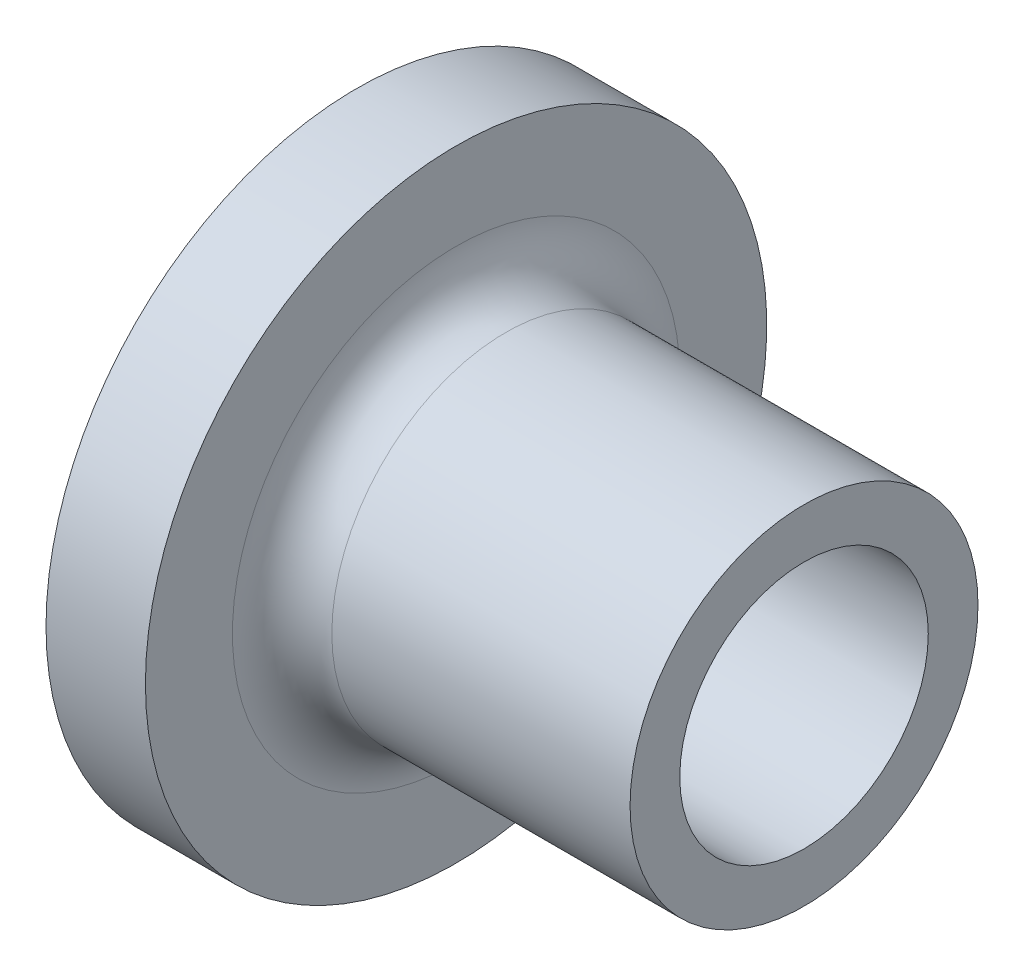
ISO-10303-21;
HEADER;
FILE_DESCRIPTION(('STEP AP214'),'2;1');
FILE_NAME('part.step','',(''),(''),'','','');
FILE_SCHEMA(('AUTOMOTIVE_DESIGN { 1 0 10303 214 1 1 1 1 }'));
ENDSEC;
DATA;
#1=APPLICATION_CONTEXT('core data for automotive mechanical design processes');
#2=APPLICATION_PROTOCOL_DEFINITION('international standard','automotive_design',2000,#1);
#3=PRODUCT_CONTEXT('',#1,'mechanical');
#4=PRODUCT('Part','Part','',(#3));
#5=PRODUCT_RELATED_PRODUCT_CATEGORY('part','',(#4));
#6=PRODUCT_DEFINITION_FORMATION('','',#4);
#7=PRODUCT_DEFINITION_CONTEXT('part definition',#1,'design');
#8=PRODUCT_DEFINITION('design','',#6,#7);
#9=PRODUCT_DEFINITION_SHAPE('','',#8);
#10=(LENGTH_UNIT() NAMED_UNIT(*) SI_UNIT(.MILLI.,.METRE.));
#11=(NAMED_UNIT(*) PLANE_ANGLE_UNIT() SI_UNIT($,.RADIAN.));
#12=(NAMED_UNIT(*) SI_UNIT($,.STERADIAN.) SOLID_ANGLE_UNIT());
#13=UNCERTAINTY_MEASURE_WITH_UNIT(LENGTH_MEASURE(1.E-05),#10,'distance_accuracy_value','');
#14=(GEOMETRIC_REPRESENTATION_CONTEXT(3) GLOBAL_UNCERTAINTY_ASSIGNED_CONTEXT((#13)) GLOBAL_UNIT_ASSIGNED_CONTEXT((#10,
#11,#12)) REPRESENTATION_CONTEXT('',''));
#15=CARTESIAN_POINT('',(0.,0.,0.));
#16=DIRECTION('',(0.,0.,1.));
#17=DIRECTION('',(1.,0.,0.));
#18=AXIS2_PLACEMENT_3D('',#15,#16,#17);
#19=CARTESIAN_POINT('',(-5.5,0.,0.));
#20=DIRECTION('',(-1.,0.,0.));
#21=DIRECTION('',(0.,0.,1.));
#22=AXIS2_PLACEMENT_3D('',#19,#20,#21);
#23=PLANE('',#22);
#24=CARTESIAN_POINT('',(-5.5,0.,0.));
#25=DIRECTION('',(-1.,0.,0.));
#26=DIRECTION('',(0.,0.,1.));
#27=AXIS2_PLACEMENT_3D('',#24,#25,#26);
#28=CIRCLE('',#27,6.25);
#29=CARTESIAN_POINT('',(-5.5,0.,6.25));
#30=VERTEX_POINT('',#29);
#31=EDGE_CURVE('E69',#30,#30,#28,.T.);
#32=ORIENTED_EDGE('',*,*,#31,.T.);
#33=EDGE_LOOP('',(#32));
#34=FACE_BOUND('',#33,.T.);
#35=CARTESIAN_POINT('',(-5.5,0.,0.));
#36=DIRECTION('',(-1.,0.,0.));
#37=DIRECTION('',(0.,0.,1.));
#38=AXIS2_PLACEMENT_3D('',#35,#36,#37);
#39=CIRCLE('',#38,2.5);
#40=CARTESIAN_POINT('',(-5.5,0.,2.5));
#41=VERTEX_POINT('',#40);
#42=EDGE_CURVE('E50',#41,#41,#39,.T.);
#43=ORIENTED_EDGE('',*,*,#42,.F.);
#44=EDGE_LOOP('',(#43));
#45=FACE_BOUND('',#44,.T.);
#46=ADVANCED_FACE('F37',(#34,#45),#23,.T.);
#47=CARTESIAN_POINT('',(0.,0.,0.));
#48=DIRECTION('',(-1.,0.,0.));
#49=DIRECTION('',(0.,0.,1.));
#50=AXIS2_PLACEMENT_3D('',#47,#48,#49);
#51=CYLINDRICAL_SURFACE('',#50,2.5);
#52=ORIENTED_EDGE('',*,*,#42,.T.);
#53=EDGE_LOOP('',(#52));
#54=FACE_BOUND('',#53,.T.);
#55=CARTESIAN_POINT('',(3.5,0.,0.));
#56=DIRECTION('',(-1.,0.,0.));
#57=DIRECTION('',(0.,0.,1.));
#58=AXIS2_PLACEMENT_3D('',#55,#56,#57);
#59=CIRCLE('',#58,2.5);
#60=CARTESIAN_POINT('',(3.5,0.,2.5));
#61=VERTEX_POINT('',#60);
#62=EDGE_CURVE('E55',#61,#61,#59,.T.);
#63=ORIENTED_EDGE('',*,*,#62,.F.);
#64=EDGE_LOOP('',(#63));
#65=FACE_BOUND('',#64,.T.);
#66=ADVANCED_FACE('F92',(#54,#65),#51,.F.);
#67=CARTESIAN_POINT('',(3.5,0.,0.));
#68=DIRECTION('',(1.,0.,0.));
#69=DIRECTION('',(0.,0.,-1.));
#70=AXIS2_PLACEMENT_3D('',#67,#68,#69);
#71=PLANE('',#70);
#72=ORIENTED_EDGE('',*,*,#62,.T.);
#73=EDGE_LOOP('',(#72));
#74=FACE_BOUND('',#73,.T.);
#75=CARTESIAN_POINT('',(3.5,0.,0.));
#76=DIRECTION('',(-1.,0.,0.));
#77=DIRECTION('',(0.,0.,1.));
#78=AXIS2_PLACEMENT_3D('',#75,#76,#77);
#79=CIRCLE('',#78,3.5);
#80=CARTESIAN_POINT('',(3.5,0.,3.5));
#81=VERTEX_POINT('',#80);
#82=EDGE_CURVE('E61',#81,#81,#79,.T.);
#83=ORIENTED_EDGE('',*,*,#82,.F.);
#84=EDGE_LOOP('',(#83));
#85=FACE_BOUND('',#84,.T.);
#86=ADVANCED_FACE('F89',(#74,#85),#71,.T.);
#87=CARTESIAN_POINT('',(0.,0.,0.));
#88=DIRECTION('',(-1.,0.,0.));
#89=DIRECTION('',(0.,0.,1.));
#90=AXIS2_PLACEMENT_3D('',#87,#88,#89);
#91=CYLINDRICAL_SURFACE('',#90,3.5);
#92=CARTESIAN_POINT('',(-2.5,0.,0.));
#93=DIRECTION('',(1.,0.,0.));
#94=DIRECTION('',(0.,0.,-1.));
#95=AXIS2_PLACEMENT_3D('',#92,#93,#94);
#96=CIRCLE('',#95,3.5);
#97=CARTESIAN_POINT('',(-2.5,0.,-3.5));
#98=VERTEX_POINT('',#97);
#99=EDGE_CURVE('E10',#98,#98,#96,.T.);
#100=ORIENTED_EDGE('',*,*,#99,.T.);
#101=EDGE_LOOP('',(#100));
#102=FACE_BOUND('',#101,.T.);
#103=ORIENTED_EDGE('',*,*,#82,.T.);
#104=EDGE_LOOP('',(#103));
#105=FACE_BOUND('',#104,.T.);
#106=ADVANCED_FACE('F84',(#102,#105),#91,.T.);
#107=CARTESIAN_POINT('',(-3.5,0.,0.));
#108=DIRECTION('',(1.,0.,0.));
#109=DIRECTION('',(0.,0.,-1.));
#110=AXIS2_PLACEMENT_3D('',#107,#108,#109);
#111=PLANE('',#110);
#112=CARTESIAN_POINT('',(-3.5,0.,0.));
#113=DIRECTION('',(1.,0.,0.));
#114=DIRECTION('',(0.,0.,-1.));
#115=AXIS2_PLACEMENT_3D('',#112,#113,#114);
#116=CIRCLE('',#115,4.5);
#117=CARTESIAN_POINT('',(-3.5,0.,-4.5));
#118=VERTEX_POINT('',#117);
#119=EDGE_CURVE('E45',#118,#118,#116,.F.);
#120=ORIENTED_EDGE('',*,*,#119,.T.);
#121=EDGE_LOOP('',(#120));
#122=FACE_BOUND('',#121,.T.);
#123=CARTESIAN_POINT('',(-3.5,0.,0.));
#124=DIRECTION('',(-1.,0.,0.));
#125=DIRECTION('',(0.,0.,1.));
#126=AXIS2_PLACEMENT_3D('',#123,#124,#125);
#127=CIRCLE('',#126,6.25);
#128=CARTESIAN_POINT('',(-3.5,0.,6.25));
#129=VERTEX_POINT('',#128);
#130=EDGE_CURVE('E65',#129,#129,#127,.T.);
#131=ORIENTED_EDGE('',*,*,#130,.F.);
#132=EDGE_LOOP('',(#131));
#133=FACE_BOUND('',#132,.T.);
#134=ADVANCED_FACE('F79',(#122,#133),#111,.T.);
#135=CARTESIAN_POINT('',(0.,0.,0.));
#136=DIRECTION('',(-1.,0.,0.));
#137=DIRECTION('',(0.,0.,1.));
#138=AXIS2_PLACEMENT_3D('',#135,#136,#137);
#139=CYLINDRICAL_SURFACE('',#138,6.25);
#140=ORIENTED_EDGE('',*,*,#31,.F.);
#141=EDGE_LOOP('',(#140));
#142=FACE_BOUND('',#141,.T.);
#143=ORIENTED_EDGE('',*,*,#130,.T.);
#144=EDGE_LOOP('',(#143));
#145=FACE_BOUND('',#144,.T.);
#146=ADVANCED_FACE('F76',(#142,#145),#139,.T.);
#147=CARTESIAN_POINT('',(-2.5,0.,0.));
#148=DIRECTION('',(1.,0.,0.));
#149=DIRECTION('',(0.,0.,-1.));
#150=AXIS2_PLACEMENT_3D('',#147,#148,#149);
#151=TOROIDAL_SURFACE('',#150,4.5,1.);
#152=ORIENTED_EDGE('',*,*,#99,.F.);
#153=EDGE_LOOP('',(#152));
#154=FACE_BOUND('',#153,.T.);
#155=ORIENTED_EDGE('',*,*,#119,.F.);
#156=EDGE_LOOP('',(#155));
#157=FACE_BOUND('',#156,.T.);
#158=ADVANCED_FACE('F39',(#154,#157),#151,.F.);
#159=CLOSED_SHELL('',(#46,#66,#86,#106,#134,#146,#158));
#160=MANIFOLD_SOLID_BREP('B2',#159);
#161=ADVANCED_BREP_SHAPE_REPRESENTATION('',(#18,#160),#14);
#162=SHAPE_DEFINITION_REPRESENTATION(#9,#161);
ENDSEC;
END-ISO-10303-21;
